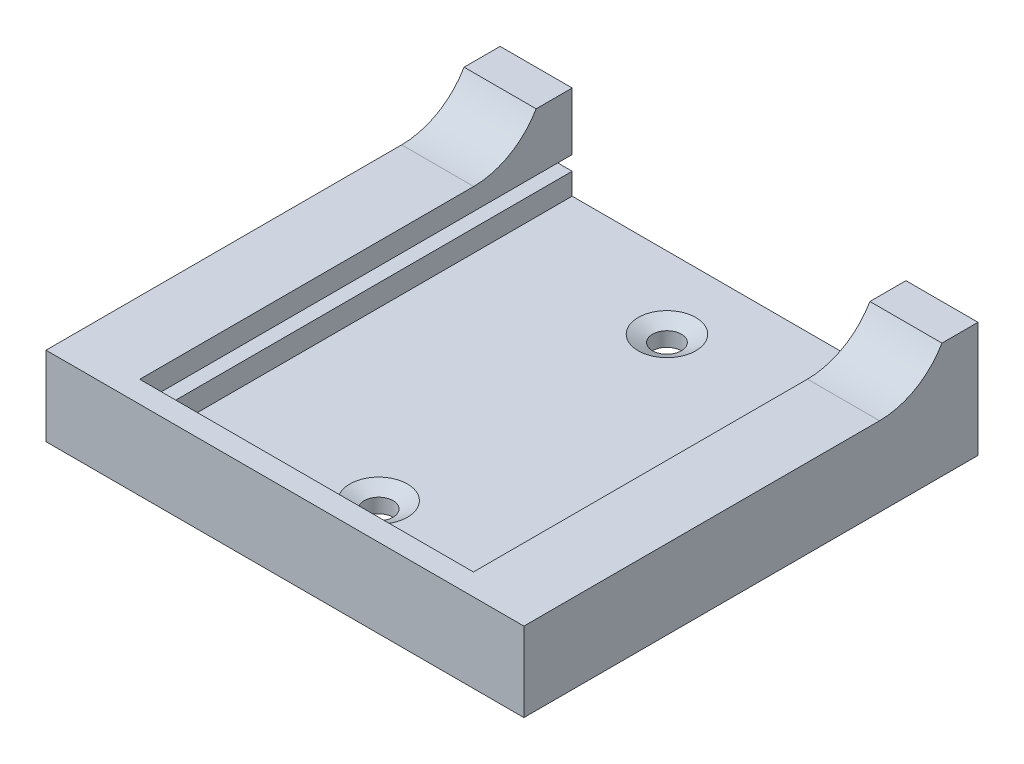
ISO-10303-21;
HEADER;
FILE_DESCRIPTION(('STEP AP214'),'2;1');
FILE_NAME('part.step','',(''),(''),'','','');
FILE_SCHEMA(('AUTOMOTIVE_DESIGN { 1 0 10303 214 1 1 1 1 }'));
ENDSEC;
DATA;
#1=APPLICATION_CONTEXT('core data for automotive mechanical design processes');
#2=APPLICATION_PROTOCOL_DEFINITION('international standard','automotive_design',2000,#1);
#3=PRODUCT_CONTEXT('',#1,'mechanical');
#4=PRODUCT('Part','Part','',(#3));
#5=PRODUCT_RELATED_PRODUCT_CATEGORY('part','',(#4));
#6=PRODUCT_DEFINITION_FORMATION('','',#4);
#7=PRODUCT_DEFINITION_CONTEXT('part definition',#1,'design');
#8=PRODUCT_DEFINITION('design','',#6,#7);
#9=PRODUCT_DEFINITION_SHAPE('','',#8);
#10=(LENGTH_UNIT() NAMED_UNIT(*) SI_UNIT(.MILLI.,.METRE.));
#11=(NAMED_UNIT(*) PLANE_ANGLE_UNIT() SI_UNIT($,.RADIAN.));
#12=(NAMED_UNIT(*) SI_UNIT($,.STERADIAN.) SOLID_ANGLE_UNIT());
#13=UNCERTAINTY_MEASURE_WITH_UNIT(LENGTH_MEASURE(1.E-05),#10,'distance_accuracy_value','');
#14=(GEOMETRIC_REPRESENTATION_CONTEXT(3) GLOBAL_UNCERTAINTY_ASSIGNED_CONTEXT((#13)) GLOBAL_UNIT_ASSIGNED_CONTEXT((#10,
#11,#12)) REPRESENTATION_CONTEXT('',''));
#15=CARTESIAN_POINT('',(0.,0.,0.));
#16=DIRECTION('',(0.,0.,1.));
#17=DIRECTION('',(1.,0.,0.));
#18=AXIS2_PLACEMENT_3D('',#15,#16,#17);
#19=CARTESIAN_POINT('',(0.,11.,72.8062484748657));
#20=DIRECTION('',(0.,-1.,0.));
#21=DIRECTION('',(0.,0.,-1.));
#22=AXIS2_PLACEMENT_3D('',#19,#20,#21);
#23=PLANE('',#22);
#24=DIRECTION('',(0.,0.,-1.));
#25=VECTOR('',#24,1.);
#26=CARTESIAN_POINT('',(66.3,11.,72.8062484748657));
#27=LINE('',#26,#25);
#28=CARTESIAN_POINT('',(66.3,11.,63.));
#29=VERTEX_POINT('',#28);
#30=CARTESIAN_POINT('',(66.3,11.,13.6602540378444));
#31=VERTEX_POINT('',#30);
#32=EDGE_CURVE('E484',#29,#31,#27,.T.);
#33=ORIENTED_EDGE('',*,*,#32,.T.);
#34=DIRECTION('',(1.,0.,0.));
#35=VECTOR('',#34,1.);
#36=CARTESIAN_POINT('',(0.,11.,13.6602540378444));
#37=LINE('',#36,#35);
#38=CARTESIAN_POINT('',(56.3,11.,13.6602540378444));
#39=VERTEX_POINT('',#38);
#40=EDGE_CURVE('E443',#31,#39,#37,.F.);
#41=ORIENTED_EDGE('',*,*,#40,.T.);
#42=DIRECTION('',(0.,0.,-1.));
#43=VECTOR('',#42,1.);
#44=CARTESIAN_POINT('',(56.3,11.,72.8062484748657));
#45=LINE('',#44,#43);
#46=CARTESIAN_POINT('',(56.3,11.,60.));
#47=VERTEX_POINT('',#46);
#48=EDGE_CURVE('E238',#47,#39,#45,.T.);
#49=ORIENTED_EDGE('',*,*,#48,.F.);
#50=DIRECTION('',(-1.,0.,0.));
#51=VECTOR('',#50,1.);
#52=CARTESIAN_POINT('',(0.,11.,60.));
#53=LINE('',#52,#51);
#54=CARTESIAN_POINT('',(10.,11.,60.));
#55=VERTEX_POINT('',#54);
#56=EDGE_CURVE('E212',#47,#55,#53,.T.);
#57=ORIENTED_EDGE('',*,*,#56,.T.);
#58=DIRECTION('',(0.,0.,-1.));
#59=VECTOR('',#58,1.);
#60=CARTESIAN_POINT('',(10.,11.,72.8062484748657));
#61=LINE('',#60,#59);
#62=CARTESIAN_POINT('',(10.,11.,13.6602540378444));
#63=VERTEX_POINT('',#62);
#64=EDGE_CURVE('E260',#55,#63,#61,.T.);
#65=ORIENTED_EDGE('',*,*,#64,.T.);
#66=DIRECTION('',(1.,0.,0.));
#67=VECTOR('',#66,1.);
#68=CARTESIAN_POINT('',(0.,11.,13.6602540378444));
#69=LINE('',#68,#67);
#70=CARTESIAN_POINT('',(0.,11.,13.6602540378444));
#71=VERTEX_POINT('',#70);
#72=EDGE_CURVE('E54',#63,#71,#69,.F.);
#73=ORIENTED_EDGE('',*,*,#72,.T.);
#74=DIRECTION('',(0.,0.,-1.));
#75=VECTOR('',#74,1.);
#76=CARTESIAN_POINT('',(0.,11.,72.8062484748657));
#77=LINE('',#76,#75);
#78=CARTESIAN_POINT('',(0.,11.,63.));
#79=VERTEX_POINT('',#78);
#80=EDGE_CURVE('E257',#79,#71,#77,.T.);
#81=ORIENTED_EDGE('',*,*,#80,.F.);
#82=DIRECTION('',(-1.,0.,0.));
#83=VECTOR('',#82,1.);
#84=CARTESIAN_POINT('',(0.,11.,63.));
#85=LINE('',#84,#83);
#86=EDGE_CURVE('E222',#29,#79,#85,.T.);
#87=ORIENTED_EDGE('',*,*,#86,.F.);
#88=EDGE_LOOP('',(#33,#41,#49,#57,#65,#73,#81,#87));
#89=FACE_BOUND('',#88,.T.);
#90=ADVANCED_FACE('F31',(#89),#23,.F.);
#91=CARTESIAN_POINT('',(0.,3.,60.));
#92=DIRECTION('',(0.,-1.,0.));
#93=DIRECTION('',(0.,0.,-1.));
#94=AXIS2_PLACEMENT_3D('',#91,#92,#93);
#95=PLANE('',#94);
#96=CARTESIAN_POINT('',(33.15,3.,10.));
#97=DIRECTION('',(0.,-1.,0.));
#98=DIRECTION('',(0.,0.,-1.));
#99=AXIS2_PLACEMENT_3D('',#96,#97,#98);
#100=CIRCLE('',#99,4.00000000000002);
#101=CARTESIAN_POINT('',(33.15,3.,5.99999999999999));
#102=VERTEX_POINT('',#101);
#103=EDGE_CURVE('E445',#102,#102,#100,.T.);
#104=ORIENTED_EDGE('',*,*,#103,.T.);
#105=EDGE_LOOP('',(#104));
#106=FACE_BOUND('',#105,.T.);
#107=CARTESIAN_POINT('',(33.15,3.,50.));
#108=DIRECTION('',(0.,-1.,0.));
#109=DIRECTION('',(0.,0.,-1.));
#110=AXIS2_PLACEMENT_3D('',#107,#108,#109);
#111=CIRCLE('',#110,4.);
#112=CARTESIAN_POINT('',(33.15,3.,46.));
#113=VERTEX_POINT('',#112);
#114=EDGE_CURVE('E449',#113,#113,#111,.T.);
#115=ORIENTED_EDGE('',*,*,#114,.T.);
#116=EDGE_LOOP('',(#115));
#117=FACE_BOUND('',#116,.T.);
#118=DIRECTION('',(0.,0.,-1.));
#119=VECTOR('',#118,1.);
#120=CARTESIAN_POINT('',(56.3,3.,72.8062484748657));
#121=LINE('',#120,#119);
#122=CARTESIAN_POINT('',(56.3,3.,60.));
#123=VERTEX_POINT('',#122);
#124=CARTESIAN_POINT('',(56.3,3.,0.));
#125=VERTEX_POINT('',#124);
#126=EDGE_CURVE('E485',#123,#125,#121,.T.);
#127=ORIENTED_EDGE('',*,*,#126,.T.);
#128=DIRECTION('',(-1.,0.,0.));
#129=VECTOR('',#128,1.);
#130=CARTESIAN_POINT('',(0.,3.,0.));
#131=LINE('',#130,#129);
#132=CARTESIAN_POINT('',(10.,3.,0.));
#133=VERTEX_POINT('',#132);
#134=EDGE_CURVE('E299',#125,#133,#131,.T.);
#135=ORIENTED_EDGE('',*,*,#134,.T.);
#136=DIRECTION('',(0.,0.,-1.));
#137=VECTOR('',#136,1.);
#138=CARTESIAN_POINT('',(10.,3.,72.8062484748657));
#139=LINE('',#138,#137);
#140=CARTESIAN_POINT('',(10.,3.,60.));
#141=VERTEX_POINT('',#140);
#142=EDGE_CURVE('E275',#141,#133,#139,.T.);
#143=ORIENTED_EDGE('',*,*,#142,.F.);
#144=DIRECTION('',(-1.,0.,0.));
#145=VECTOR('',#144,1.);
#146=CARTESIAN_POINT('',(0.,3.,60.));
#147=LINE('',#146,#145);
#148=EDGE_CURVE('E302',#123,#141,#147,.T.);
#149=ORIENTED_EDGE('',*,*,#148,.F.);
#150=EDGE_LOOP('',(#127,#135,#143,#149));
#151=FACE_BOUND('',#150,.T.);
#152=ADVANCED_FACE('F321',(#106,#117,#151),#95,.F.);
#153=CARTESIAN_POINT('',(0.,0.,60.));
#154=DIRECTION('',(1.,0.,0.));
#155=DIRECTION('',(0.,0.,-1.));
#156=AXIS2_PLACEMENT_3D('',#153,#154,#155);
#157=PLANE('',#156);
#158=DIRECTION('',(0.,-1.,0.));
#159=VECTOR('',#158,1.);
#160=CARTESIAN_POINT('',(0.,0.,0.));
#161=LINE('',#160,#159);
#162=CARTESIAN_POINT('',(0.,16.,0.));
#163=VERTEX_POINT('',#162);
#164=CARTESIAN_POINT('',(0.,0.,0.));
#165=VERTEX_POINT('',#164);
#166=EDGE_CURVE('E295',#163,#165,#161,.T.);
#167=ORIENTED_EDGE('',*,*,#166,.T.);
#168=DIRECTION('',(0.,0.,-1.));
#169=VECTOR('',#168,1.);
#170=CARTESIAN_POINT('',(0.,0.,60.));
#171=LINE('',#170,#169);
#172=CARTESIAN_POINT('',(0.,0.,63.));
#173=VERTEX_POINT('',#172);
#174=EDGE_CURVE('E285',#173,#165,#171,.T.);
#175=ORIENTED_EDGE('',*,*,#174,.F.);
#176=DIRECTION('',(0.,-1.,0.));
#177=VECTOR('',#176,1.);
#178=CARTESIAN_POINT('',(0.,11.,63.));
#179=LINE('',#178,#177);
#180=EDGE_CURVE('E213',#79,#173,#179,.T.);
#181=ORIENTED_EDGE('',*,*,#180,.F.);
#182=ORIENTED_EDGE('',*,*,#80,.T.);
#183=CARTESIAN_POINT('',(0.,21.,13.6602540378444));
#184=DIRECTION('',(1.,0.,0.));
#185=DIRECTION('',(0.,0.,-1.));
#186=AXIS2_PLACEMENT_3D('',#183,#184,#185);
#187=CIRCLE('',#186,10.);
#188=CARTESIAN_POINT('',(0.,16.,5.));
#189=VERTEX_POINT('',#188);
#190=EDGE_CURVE('E11',#71,#189,#187,.T.);
#191=ORIENTED_EDGE('',*,*,#190,.T.);
#192=DIRECTION('',(0.,0.,1.));
#193=VECTOR('',#192,1.);
#194=CARTESIAN_POINT('',(0.,16.,0.));
#195=LINE('',#194,#193);
#196=EDGE_CURVE('E200',#163,#189,#195,.T.);
#197=ORIENTED_EDGE('',*,*,#196,.F.);
#198=EDGE_LOOP('',(#167,#175,#181,#182,#191,#197));
#199=FACE_BOUND('',#198,.T.);
#200=ADVANCED_FACE('F370',(#199),#157,.F.);
#201=CARTESIAN_POINT('',(0.,0.,60.));
#202=DIRECTION('',(0.,1.,0.));
#203=DIRECTION('',(0.,0.,1.));
#204=AXIS2_PLACEMENT_3D('',#201,#202,#203);
#205=PLANE('',#204);
#206=CARTESIAN_POINT('',(33.15,0.,50.));
#207=DIRECTION('',(0.,1.,0.));
#208=DIRECTION('',(0.,0.,1.));
#209=AXIS2_PLACEMENT_3D('',#206,#207,#208);
#210=CIRCLE('',#209,2.);
#211=CARTESIAN_POINT('',(33.15,0.,52.));
#212=VERTEX_POINT('',#211);
#213=EDGE_CURVE('E225',#212,#212,#210,.T.);
#214=ORIENTED_EDGE('',*,*,#213,.T.);
#215=EDGE_LOOP('',(#214));
#216=FACE_BOUND('',#215,.T.);
#217=CARTESIAN_POINT('',(33.15,0.,10.));
#218=DIRECTION('',(0.,1.,0.));
#219=DIRECTION('',(0.,0.,1.));
#220=AXIS2_PLACEMENT_3D('',#217,#218,#219);
#221=CIRCLE('',#220,2.);
#222=CARTESIAN_POINT('',(33.15,0.,12.));
#223=VERTEX_POINT('',#222);
#224=EDGE_CURVE('E180',#223,#223,#221,.T.);
#225=ORIENTED_EDGE('',*,*,#224,.T.);
#226=EDGE_LOOP('',(#225));
#227=FACE_BOUND('',#226,.T.);
#228=DIRECTION('',(1.,0.,0.));
#229=VECTOR('',#228,1.);
#230=CARTESIAN_POINT('',(0.,0.,0.));
#231=LINE('',#230,#229);
#232=CARTESIAN_POINT('',(66.3,0.,0.));
#233=VERTEX_POINT('',#232);
#234=EDGE_CURVE('E358',#165,#233,#231,.T.);
#235=ORIENTED_EDGE('',*,*,#234,.T.);
#236=DIRECTION('',(0.,0.,-1.));
#237=VECTOR('',#236,1.);
#238=CARTESIAN_POINT('',(66.3,0.,60.));
#239=LINE('',#238,#237);
#240=CARTESIAN_POINT('',(66.3,0.,63.));
#241=VERTEX_POINT('',#240);
#242=EDGE_CURVE('E308',#241,#233,#239,.T.);
#243=ORIENTED_EDGE('',*,*,#242,.F.);
#244=DIRECTION('',(1.,0.,0.));
#245=VECTOR('',#244,1.);
#246=CARTESIAN_POINT('',(0.,0.,63.));
#247=LINE('',#246,#245);
#248=EDGE_CURVE('E216',#173,#241,#247,.T.);
#249=ORIENTED_EDGE('',*,*,#248,.F.);
#250=ORIENTED_EDGE('',*,*,#174,.T.);
#251=EDGE_LOOP('',(#235,#243,#249,#250));
#252=FACE_BOUND('',#251,.T.);
#253=ADVANCED_FACE('F363',(#216,#227,#252),#205,.F.);
#254=CARTESIAN_POINT('',(66.3,0.,60.));
#255=DIRECTION('',(-1.,0.,0.));
#256=DIRECTION('',(0.,0.,1.));
#257=AXIS2_PLACEMENT_3D('',#254,#255,#256);
#258=PLANE('',#257);
#259=DIRECTION('',(0.,1.,0.));
#260=VECTOR('',#259,1.);
#261=CARTESIAN_POINT('',(66.3,0.,0.));
#262=LINE('',#261,#260);
#263=CARTESIAN_POINT('',(66.3,16.,0.));
#264=VERTEX_POINT('',#263);
#265=EDGE_CURVE('E303',#233,#264,#262,.T.);
#266=ORIENTED_EDGE('',*,*,#265,.T.);
#267=DIRECTION('',(0.,0.,-1.));
#268=VECTOR('',#267,1.);
#269=CARTESIAN_POINT('',(66.3,16.,0.));
#270=LINE('',#269,#268);
#271=CARTESIAN_POINT('',(66.3,16.,5.));
#272=VERTEX_POINT('',#271);
#273=EDGE_CURVE('E195',#272,#264,#270,.T.);
#274=ORIENTED_EDGE('',*,*,#273,.F.);
#275=CARTESIAN_POINT('',(66.3,21.,13.6602540378444));
#276=DIRECTION('',(-1.,0.,0.));
#277=DIRECTION('',(0.,0.,1.));
#278=AXIS2_PLACEMENT_3D('',#275,#276,#277);
#279=CIRCLE('',#278,10.);
#280=EDGE_CURVE('E46',#272,#31,#279,.T.);
#281=ORIENTED_EDGE('',*,*,#280,.T.);
#282=ORIENTED_EDGE('',*,*,#32,.F.);
#283=DIRECTION('',(0.,1.,0.));
#284=VECTOR('',#283,1.);
#285=CARTESIAN_POINT('',(66.3,11.,63.));
#286=LINE('',#285,#284);
#287=EDGE_CURVE('E219',#241,#29,#286,.T.);
#288=ORIENTED_EDGE('',*,*,#287,.F.);
#289=ORIENTED_EDGE('',*,*,#242,.T.);
#290=EDGE_LOOP('',(#266,#274,#281,#282,#288,#289));
#291=FACE_BOUND('',#290,.T.);
#292=ADVANCED_FACE('F361',(#291),#258,.F.);
#293=CARTESIAN_POINT('',(0.,3.,0.));
#294=DIRECTION('',(0.,0.,-1.));
#295=DIRECTION('',(-1.,0.,0.));
#296=AXIS2_PLACEMENT_3D('',#293,#294,#295);
#297=PLANE('',#296);
#298=ORIENTED_EDGE('',*,*,#166,.F.);
#299=DIRECTION('',(-1.,0.,0.));
#300=VECTOR('',#299,1.);
#301=CARTESIAN_POINT('',(0.,16.,0.));
#302=LINE('',#301,#300);
#303=CARTESIAN_POINT('',(10.,16.,0.));
#304=VERTEX_POINT('',#303);
#305=EDGE_CURVE('E209',#304,#163,#302,.T.);
#306=ORIENTED_EDGE('',*,*,#305,.F.);
#307=DIRECTION('',(0.,1.,0.));
#308=VECTOR('',#307,1.);
#309=CARTESIAN_POINT('',(10.,11.,0.));
#310=LINE('',#309,#308);
#311=CARTESIAN_POINT('',(10.,8.,0.));
#312=VERTEX_POINT('',#311);
#313=EDGE_CURVE('E261',#312,#304,#310,.T.);
#314=ORIENTED_EDGE('',*,*,#313,.F.);
#315=DIRECTION('',(1.,0.,0.));
#316=VECTOR('',#315,1.);
#317=CARTESIAN_POINT('',(3.,8.,0.));
#318=LINE('',#317,#316);
#319=CARTESIAN_POINT('',(3.,8.,0.));
#320=VERTEX_POINT('',#319);
#321=EDGE_CURVE('E341',#320,#312,#318,.T.);
#322=ORIENTED_EDGE('',*,*,#321,.F.);
#323=DIRECTION('',(0.,1.,0.));
#324=VECTOR('',#323,1.);
#325=CARTESIAN_POINT('',(3.,6.,0.));
#326=LINE('',#325,#324);
#327=CARTESIAN_POINT('',(3.,6.,0.));
#328=VERTEX_POINT('',#327);
#329=EDGE_CURVE('E339',#328,#320,#326,.T.);
#330=ORIENTED_EDGE('',*,*,#329,.F.);
#331=DIRECTION('',(-1.,0.,0.));
#332=VECTOR('',#331,1.);
#333=CARTESIAN_POINT('',(3.,6.,0.));
#334=LINE('',#333,#332);
#335=CARTESIAN_POINT('',(10.,6.,0.));
#336=VERTEX_POINT('',#335);
#337=EDGE_CURVE('E289',#336,#328,#334,.T.);
#338=ORIENTED_EDGE('',*,*,#337,.F.);
#339=DIRECTION('',(0.,1.,0.));
#340=VECTOR('',#339,1.);
#341=CARTESIAN_POINT('',(10.,6.,0.));
#342=LINE('',#341,#340);
#343=EDGE_CURVE('E254',#133,#336,#342,.T.);
#344=ORIENTED_EDGE('',*,*,#343,.F.);
#345=ORIENTED_EDGE('',*,*,#134,.F.);
#346=DIRECTION('',(0.,-1.,0.));
#347=VECTOR('',#346,1.);
#348=CARTESIAN_POINT('',(56.3,6.,0.));
#349=LINE('',#348,#347);
#350=CARTESIAN_POINT('',(56.3,6.,0.));
#351=VERTEX_POINT('',#350);
#352=EDGE_CURVE('E486',#351,#125,#349,.T.);
#353=ORIENTED_EDGE('',*,*,#352,.F.);
#354=DIRECTION('',(-1.,0.,0.));
#355=VECTOR('',#354,1.);
#356=CARTESIAN_POINT('',(63.3,6.,0.));
#357=LINE('',#356,#355);
#358=CARTESIAN_POINT('',(63.3,6.,0.));
#359=VERTEX_POINT('',#358);
#360=EDGE_CURVE('E491',#359,#351,#357,.T.);
#361=ORIENTED_EDGE('',*,*,#360,.F.);
#362=DIRECTION('',(0.,-1.,0.));
#363=VECTOR('',#362,1.);
#364=CARTESIAN_POINT('',(63.3,6.,0.));
#365=LINE('',#364,#363);
#366=CARTESIAN_POINT('',(63.3,8.,0.));
#367=VERTEX_POINT('',#366);
#368=EDGE_CURVE('E498',#367,#359,#365,.T.);
#369=ORIENTED_EDGE('',*,*,#368,.F.);
#370=DIRECTION('',(1.,0.,0.));
#371=VECTOR('',#370,1.);
#372=CARTESIAN_POINT('',(63.3,8.,0.));
#373=LINE('',#372,#371);
#374=CARTESIAN_POINT('',(56.3,8.,0.));
#375=VERTEX_POINT('',#374);
#376=EDGE_CURVE('E177',#375,#367,#373,.T.);
#377=ORIENTED_EDGE('',*,*,#376,.F.);
#378=DIRECTION('',(0.,-1.,0.));
#379=VECTOR('',#378,1.);
#380=CARTESIAN_POINT('',(56.3,11.,0.));
#381=LINE('',#380,#379);
#382=CARTESIAN_POINT('',(56.3,16.,0.));
#383=VERTEX_POINT('',#382);
#384=EDGE_CURVE('E169',#383,#375,#381,.T.);
#385=ORIENTED_EDGE('',*,*,#384,.F.);
#386=DIRECTION('',(-1.,0.,0.));
#387=VECTOR('',#386,1.);
#388=CARTESIAN_POINT('',(66.3,16.,0.));
#389=LINE('',#388,#387);
#390=EDGE_CURVE('E174',#264,#383,#389,.T.);
#391=ORIENTED_EDGE('',*,*,#390,.F.);
#392=ORIENTED_EDGE('',*,*,#265,.F.);
#393=ORIENTED_EDGE('',*,*,#234,.F.);
#394=EDGE_LOOP('',(#298,#306,#314,#322,#330,#338,#344,#345,#353,#361,#369,#377,#385,#391,#392,#393));
#395=FACE_BOUND('',#394,.T.);
#396=ADVANCED_FACE('F171',(#395),#297,.T.);
#397=CARTESIAN_POINT('',(10.,11.,72.8062484748657));
#398=DIRECTION('',(-1.,0.,0.));
#399=DIRECTION('',(0.,0.,1.));
#400=AXIS2_PLACEMENT_3D('',#397,#398,#399);
#401=PLANE('',#400);
#402=ORIENTED_EDGE('',*,*,#64,.F.);
#403=DIRECTION('',(0.,-1.,0.));
#404=VECTOR('',#403,1.);
#405=CARTESIAN_POINT('',(10.,11.,60.));
#406=LINE('',#405,#404);
#407=CARTESIAN_POINT('',(10.,8.,60.));
#408=VERTEX_POINT('',#407);
#409=EDGE_CURVE('E284',#55,#408,#406,.T.);
#410=ORIENTED_EDGE('',*,*,#409,.T.);
#411=DIRECTION('',(0.,0.,-1.));
#412=VECTOR('',#411,1.);
#413=CARTESIAN_POINT('',(10.,8.,72.8062484748657));
#414=LINE('',#413,#412);
#415=EDGE_CURVE('E267',#408,#312,#414,.T.);
#416=ORIENTED_EDGE('',*,*,#415,.T.);
#417=ORIENTED_EDGE('',*,*,#313,.T.);
#418=DIRECTION('',(0.,0.,-1.));
#419=VECTOR('',#418,1.);
#420=CARTESIAN_POINT('',(10.,16.,0.));
#421=LINE('',#420,#419);
#422=CARTESIAN_POINT('',(10.,16.,5.));
#423=VERTEX_POINT('',#422);
#424=EDGE_CURVE('E206',#423,#304,#421,.T.);
#425=ORIENTED_EDGE('',*,*,#424,.F.);
#426=CARTESIAN_POINT('',(10.,21.,13.6602540378444));
#427=DIRECTION('',(-1.,0.,0.));
#428=DIRECTION('',(0.,0.,1.));
#429=AXIS2_PLACEMENT_3D('',#426,#427,#428);
#430=CIRCLE('',#429,10.);
#431=EDGE_CURVE('E39',#423,#63,#430,.T.);
#432=ORIENTED_EDGE('',*,*,#431,.T.);
#433=EDGE_LOOP('',(#402,#410,#416,#417,#425,#432));
#434=FACE_BOUND('',#433,.T.);
#435=ADVANCED_FACE('F350',(#434),#401,.F.);
#436=CARTESIAN_POINT('',(3.,8.,72.8062484748657));
#437=DIRECTION('',(0.,1.,0.));
#438=DIRECTION('',(0.,0.,1.));
#439=AXIS2_PLACEMENT_3D('',#436,#437,#438);
#440=PLANE('',#439);
#441=ORIENTED_EDGE('',*,*,#415,.F.);
#442=DIRECTION('',(-1.,0.,0.));
#443=VECTOR('',#442,1.);
#444=CARTESIAN_POINT('',(3.,8.,60.));
#445=LINE('',#444,#443);
#446=CARTESIAN_POINT('',(3.,8.,60.));
#447=VERTEX_POINT('',#446);
#448=EDGE_CURVE('E334',#408,#447,#445,.T.);
#449=ORIENTED_EDGE('',*,*,#448,.T.);
#450=DIRECTION('',(0.,0.,-1.));
#451=VECTOR('',#450,1.);
#452=CARTESIAN_POINT('',(3.,8.,72.8062484748657));
#453=LINE('',#452,#451);
#454=EDGE_CURVE('E269',#447,#320,#453,.T.);
#455=ORIENTED_EDGE('',*,*,#454,.T.);
#456=ORIENTED_EDGE('',*,*,#321,.T.);
#457=EDGE_LOOP('',(#441,#449,#455,#456));
#458=FACE_BOUND('',#457,.T.);
#459=ADVANCED_FACE('F385',(#458),#440,.F.);
#460=CARTESIAN_POINT('',(3.,6.,72.8062484748657));
#461=DIRECTION('',(-1.,0.,0.));
#462=DIRECTION('',(0.,0.,1.));
#463=AXIS2_PLACEMENT_3D('',#460,#461,#462);
#464=PLANE('',#463);
#465=ORIENTED_EDGE('',*,*,#454,.F.);
#466=DIRECTION('',(0.,-1.,0.));
#467=VECTOR('',#466,1.);
#468=CARTESIAN_POINT('',(3.,6.,60.));
#469=LINE('',#468,#467);
#470=CARTESIAN_POINT('',(3.,6.,60.));
#471=VERTEX_POINT('',#470);
#472=EDGE_CURVE('E332',#447,#471,#469,.T.);
#473=ORIENTED_EDGE('',*,*,#472,.T.);
#474=DIRECTION('',(0.,0.,-1.));
#475=VECTOR('',#474,1.);
#476=CARTESIAN_POINT('',(3.,6.,72.8062484748657));
#477=LINE('',#476,#475);
#478=EDGE_CURVE('E271',#471,#328,#477,.T.);
#479=ORIENTED_EDGE('',*,*,#478,.T.);
#480=ORIENTED_EDGE('',*,*,#329,.T.);
#481=EDGE_LOOP('',(#465,#473,#479,#480));
#482=FACE_BOUND('',#481,.T.);
#483=ADVANCED_FACE('F388',(#482),#464,.F.);
#484=CARTESIAN_POINT('',(3.,6.,72.8062484748657));
#485=DIRECTION('',(0.,-1.,0.));
#486=DIRECTION('',(0.,0.,-1.));
#487=AXIS2_PLACEMENT_3D('',#484,#485,#486);
#488=PLANE('',#487);
#489=ORIENTED_EDGE('',*,*,#478,.F.);
#490=DIRECTION('',(1.,0.,0.));
#491=VECTOR('',#490,1.);
#492=CARTESIAN_POINT('',(3.,6.,60.));
#493=LINE('',#492,#491);
#494=CARTESIAN_POINT('',(10.,6.,60.));
#495=VERTEX_POINT('',#494);
#496=EDGE_CURVE('E296',#471,#495,#493,.T.);
#497=ORIENTED_EDGE('',*,*,#496,.T.);
#498=DIRECTION('',(0.,0.,-1.));
#499=VECTOR('',#498,1.);
#500=CARTESIAN_POINT('',(10.,6.,72.8062484748657));
#501=LINE('',#500,#499);
#502=EDGE_CURVE('E273',#495,#336,#501,.T.);
#503=ORIENTED_EDGE('',*,*,#502,.T.);
#504=ORIENTED_EDGE('',*,*,#337,.T.);
#505=EDGE_LOOP('',(#489,#497,#503,#504));
#506=FACE_BOUND('',#505,.T.);
#507=ADVANCED_FACE('F330',(#506),#488,.F.);
#508=CARTESIAN_POINT('',(10.,6.,72.8062484748657));
#509=DIRECTION('',(-1.,0.,0.));
#510=DIRECTION('',(0.,-1.,0.));
#511=AXIS2_PLACEMENT_3D('',#508,#509,#510);
#512=PLANE('',#511);
#513=ORIENTED_EDGE('',*,*,#502,.F.);
#514=DIRECTION('',(0.,-1.,0.));
#515=VECTOR('',#514,1.);
#516=CARTESIAN_POINT('',(10.,6.,60.));
#517=LINE('',#516,#515);
#518=EDGE_CURVE('E292',#495,#141,#517,.T.);
#519=ORIENTED_EDGE('',*,*,#518,.T.);
#520=ORIENTED_EDGE('',*,*,#142,.T.);
#521=ORIENTED_EDGE('',*,*,#343,.T.);
#522=EDGE_LOOP('',(#513,#519,#520,#521));
#523=FACE_BOUND('',#522,.T.);
#524=ADVANCED_FACE('F324',(#523),#512,.F.);
#525=CARTESIAN_POINT('',(56.3,6.,72.8062484748657));
#526=DIRECTION('',(1.,0.,0.));
#527=DIRECTION('',(0.,1.,0.));
#528=AXIS2_PLACEMENT_3D('',#525,#526,#527);
#529=PLANE('',#528);
#530=ORIENTED_EDGE('',*,*,#126,.F.);
#531=DIRECTION('',(0.,1.,0.));
#532=VECTOR('',#531,1.);
#533=CARTESIAN_POINT('',(56.3,6.,60.));
#534=LINE('',#533,#532);
#535=CARTESIAN_POINT('',(56.3,6.,60.));
#536=VERTEX_POINT('',#535);
#537=EDGE_CURVE('E234',#123,#536,#534,.T.);
#538=ORIENTED_EDGE('',*,*,#537,.T.);
#539=DIRECTION('',(0.,0.,-1.));
#540=VECTOR('',#539,1.);
#541=CARTESIAN_POINT('',(56.3,6.,72.8062484748657));
#542=LINE('',#541,#540);
#543=EDGE_CURVE('E488',#536,#351,#542,.T.);
#544=ORIENTED_EDGE('',*,*,#543,.T.);
#545=ORIENTED_EDGE('',*,*,#352,.T.);
#546=EDGE_LOOP('',(#530,#538,#544,#545));
#547=FACE_BOUND('',#546,.T.);
#548=ADVANCED_FACE('F395',(#547),#529,.F.);
#549=CARTESIAN_POINT('',(63.3,6.,72.8062484748657));
#550=DIRECTION('',(0.,-1.,0.));
#551=DIRECTION('',(0.,0.,-1.));
#552=AXIS2_PLACEMENT_3D('',#549,#550,#551);
#553=PLANE('',#552);
#554=ORIENTED_EDGE('',*,*,#543,.F.);
#555=DIRECTION('',(1.,0.,0.));
#556=VECTOR('',#555,1.);
#557=CARTESIAN_POINT('',(63.3,6.,60.));
#558=LINE('',#557,#556);
#559=CARTESIAN_POINT('',(63.3,6.,60.));
#560=VERTEX_POINT('',#559);
#561=EDGE_CURVE('E237',#536,#560,#558,.T.);
#562=ORIENTED_EDGE('',*,*,#561,.T.);
#563=DIRECTION('',(0.,0.,-1.));
#564=VECTOR('',#563,1.);
#565=CARTESIAN_POINT('',(63.3,6.,72.8062484748657));
#566=LINE('',#565,#564);
#567=EDGE_CURVE('E424',#560,#359,#566,.T.);
#568=ORIENTED_EDGE('',*,*,#567,.T.);
#569=ORIENTED_EDGE('',*,*,#360,.T.);
#570=EDGE_LOOP('',(#554,#562,#568,#569));
#571=FACE_BOUND('',#570,.T.);
#572=ADVANCED_FACE('F399',(#571),#553,.F.);
#573=CARTESIAN_POINT('',(63.3,6.,72.8062484748657));
#574=DIRECTION('',(1.,0.,0.));
#575=DIRECTION('',(0.,0.,-1.));
#576=AXIS2_PLACEMENT_3D('',#573,#574,#575);
#577=PLANE('',#576);
#578=ORIENTED_EDGE('',*,*,#567,.F.);
#579=DIRECTION('',(0.,1.,0.));
#580=VECTOR('',#579,1.);
#581=CARTESIAN_POINT('',(63.3,6.,60.));
#582=LINE('',#581,#580);
#583=CARTESIAN_POINT('',(63.3,8.,60.));
#584=VERTEX_POINT('',#583);
#585=EDGE_CURVE('E241',#560,#584,#582,.T.);
#586=ORIENTED_EDGE('',*,*,#585,.T.);
#587=DIRECTION('',(0.,0.,-1.));
#588=VECTOR('',#587,1.);
#589=CARTESIAN_POINT('',(63.3,8.,72.8062484748657));
#590=LINE('',#589,#588);
#591=EDGE_CURVE('E421',#584,#367,#590,.T.);
#592=ORIENTED_EDGE('',*,*,#591,.T.);
#593=ORIENTED_EDGE('',*,*,#368,.T.);
#594=EDGE_LOOP('',(#578,#586,#592,#593));
#595=FACE_BOUND('',#594,.T.);
#596=ADVANCED_FACE('F405',(#595),#577,.F.);
#597=CARTESIAN_POINT('',(63.3,8.,72.8062484748657));
#598=DIRECTION('',(0.,1.,0.));
#599=DIRECTION('',(0.,0.,1.));
#600=AXIS2_PLACEMENT_3D('',#597,#598,#599);
#601=PLANE('',#600);
#602=ORIENTED_EDGE('',*,*,#591,.F.);
#603=DIRECTION('',(-1.,0.,0.));
#604=VECTOR('',#603,1.);
#605=CARTESIAN_POINT('',(63.3,8.,60.));
#606=LINE('',#605,#604);
#607=CARTESIAN_POINT('',(56.3,8.,60.));
#608=VERTEX_POINT('',#607);
#609=EDGE_CURVE('E244',#584,#608,#606,.T.);
#610=ORIENTED_EDGE('',*,*,#609,.T.);
#611=DIRECTION('',(0.,0.,-1.));
#612=VECTOR('',#611,1.);
#613=CARTESIAN_POINT('',(56.3,8.,72.8062484748657));
#614=LINE('',#613,#612);
#615=EDGE_CURVE('E423',#608,#375,#614,.T.);
#616=ORIENTED_EDGE('',*,*,#615,.T.);
#617=ORIENTED_EDGE('',*,*,#376,.T.);
#618=EDGE_LOOP('',(#602,#610,#616,#617));
#619=FACE_BOUND('',#618,.T.);
#620=ADVANCED_FACE('F413',(#619),#601,.F.);
#621=CARTESIAN_POINT('',(56.3,11.,72.8062484748657));
#622=DIRECTION('',(1.,0.,0.));
#623=DIRECTION('',(0.,0.,-1.));
#624=AXIS2_PLACEMENT_3D('',#621,#622,#623);
#625=PLANE('',#624);
#626=ORIENTED_EDGE('',*,*,#615,.F.);
#627=DIRECTION('',(0.,1.,0.));
#628=VECTOR('',#627,1.);
#629=CARTESIAN_POINT('',(56.3,11.,60.));
#630=LINE('',#629,#628);
#631=EDGE_CURVE('E247',#608,#47,#630,.T.);
#632=ORIENTED_EDGE('',*,*,#631,.T.);
#633=ORIENTED_EDGE('',*,*,#48,.T.);
#634=CARTESIAN_POINT('',(56.3,21.,13.6602540378444));
#635=DIRECTION('',(1.,0.,0.));
#636=DIRECTION('',(0.,0.,-1.));
#637=AXIS2_PLACEMENT_3D('',#634,#635,#636);
#638=CIRCLE('',#637,10.);
#639=CARTESIAN_POINT('',(56.3,16.,5.));
#640=VERTEX_POINT('',#639);
#641=EDGE_CURVE('E187',#39,#640,#638,.T.);
#642=ORIENTED_EDGE('',*,*,#641,.T.);
#643=DIRECTION('',(0.,0.,1.));
#644=VECTOR('',#643,1.);
#645=CARTESIAN_POINT('',(56.3,16.,0.));
#646=LINE('',#645,#644);
#647=EDGE_CURVE('E183',#383,#640,#646,.T.);
#648=ORIENTED_EDGE('',*,*,#647,.F.);
#649=ORIENTED_EDGE('',*,*,#384,.T.);
#650=EDGE_LOOP('',(#626,#632,#633,#642,#648,#649));
#651=FACE_BOUND('',#650,.T.);
#652=ADVANCED_FACE('F184',(#651),#625,.F.);
#653=CARTESIAN_POINT('',(33.15,0.,10.));
#654=DIRECTION('',(0.,1.,0.));
#655=DIRECTION('',(0.,0.,1.));
#656=AXIS2_PLACEMENT_3D('',#653,#654,#655);
#657=CYLINDRICAL_SURFACE('',#656,2.);
#658=CARTESIAN_POINT('',(33.15,1.99999999999999,10.));
#659=DIRECTION('',(0.,-1.,0.));
#660=DIRECTION('',(0.,0.,-1.));
#661=AXIS2_PLACEMENT_3D('',#658,#659,#660);
#662=CIRCLE('',#661,2.);
#663=CARTESIAN_POINT('',(33.15,1.99999999999999,8.));
#664=VERTEX_POINT('',#663);
#665=EDGE_CURVE('E312',#664,#664,#662,.F.);
#666=ORIENTED_EDGE('',*,*,#665,.T.);
#667=EDGE_LOOP('',(#666));
#668=FACE_BOUND('',#667,.T.);
#669=ORIENTED_EDGE('',*,*,#224,.F.);
#670=EDGE_LOOP('',(#669));
#671=FACE_BOUND('',#670,.T.);
#672=ADVANCED_FACE('F409',(#668,#671),#657,.F.);
#673=CARTESIAN_POINT('',(33.15,0.,50.));
#674=DIRECTION('',(0.,1.,0.));
#675=DIRECTION('',(0.,0.,1.));
#676=AXIS2_PLACEMENT_3D('',#673,#674,#675);
#677=CYLINDRICAL_SURFACE('',#676,2.);
#678=CARTESIAN_POINT('',(33.15,2.,50.));
#679=DIRECTION('',(0.,-1.,0.));
#680=DIRECTION('',(0.,0.,-1.));
#681=AXIS2_PLACEMENT_3D('',#678,#679,#680);
#682=CIRCLE('',#681,2.);
#683=CARTESIAN_POINT('',(33.15,2.,48.));
#684=VERTEX_POINT('',#683);
#685=EDGE_CURVE('E435',#684,#684,#682,.F.);
#686=ORIENTED_EDGE('',*,*,#685,.T.);
#687=EDGE_LOOP('',(#686));
#688=FACE_BOUND('',#687,.T.);
#689=ORIENTED_EDGE('',*,*,#213,.F.);
#690=EDGE_LOOP('',(#689));
#691=FACE_BOUND('',#690,.T.);
#692=ADVANCED_FACE('F461',(#688,#691),#677,.F.);
#693=CARTESIAN_POINT('',(33.15,1.99999999999999,10.));
#694=DIRECTION('',(0.,1.,0.));
#695=DIRECTION('',(0.,0.,1.));
#696=AXIS2_PLACEMENT_3D('',#693,#694,#695);
#697=CONICAL_SURFACE('',#696,2.,1.10714871779409);
#698=ORIENTED_EDGE('',*,*,#103,.F.);
#699=EDGE_LOOP('',(#698));
#700=FACE_BOUND('',#699,.T.);
#701=ORIENTED_EDGE('',*,*,#665,.F.);
#702=EDGE_LOOP('',(#701));
#703=FACE_BOUND('',#702,.T.);
#704=ADVANCED_FACE('F458',(#700,#703),#697,.F.);
#705=CARTESIAN_POINT('',(33.15,2.,50.));
#706=DIRECTION('',(0.,1.,0.));
#707=DIRECTION('',(0.,0.,1.));
#708=AXIS2_PLACEMENT_3D('',#705,#706,#707);
#709=CONICAL_SURFACE('',#708,2.,1.10714871779409);
#710=ORIENTED_EDGE('',*,*,#114,.F.);
#711=EDGE_LOOP('',(#710));
#712=FACE_BOUND('',#711,.T.);
#713=ORIENTED_EDGE('',*,*,#685,.F.);
#714=EDGE_LOOP('',(#713));
#715=FACE_BOUND('',#714,.T.);
#716=ADVANCED_FACE('F460',(#712,#715),#709,.F.);
#717=CARTESIAN_POINT('',(0.,0.,63.));
#718=DIRECTION('',(0.,0.,1.));
#719=DIRECTION('',(1.,0.,0.));
#720=AXIS2_PLACEMENT_3D('',#717,#718,#719);
#721=PLANE('',#720);
#722=ORIENTED_EDGE('',*,*,#180,.T.);
#723=ORIENTED_EDGE('',*,*,#248,.T.);
#724=ORIENTED_EDGE('',*,*,#287,.T.);
#725=ORIENTED_EDGE('',*,*,#86,.T.);
#726=EDGE_LOOP('',(#722,#723,#724,#725));
#727=FACE_BOUND('',#726,.T.);
#728=ADVANCED_FACE('F468',(#727),#721,.T.);
#729=CARTESIAN_POINT('',(0.,0.,60.));
#730=DIRECTION('',(0.,0.,1.));
#731=DIRECTION('',(1.,0.,0.));
#732=AXIS2_PLACEMENT_3D('',#729,#730,#731);
#733=PLANE('',#732);
#734=ORIENTED_EDGE('',*,*,#631,.F.);
#735=ORIENTED_EDGE('',*,*,#609,.F.);
#736=ORIENTED_EDGE('',*,*,#585,.F.);
#737=ORIENTED_EDGE('',*,*,#561,.F.);
#738=ORIENTED_EDGE('',*,*,#537,.F.);
#739=ORIENTED_EDGE('',*,*,#148,.T.);
#740=ORIENTED_EDGE('',*,*,#518,.F.);
#741=ORIENTED_EDGE('',*,*,#496,.F.);
#742=ORIENTED_EDGE('',*,*,#472,.F.);
#743=ORIENTED_EDGE('',*,*,#448,.F.);
#744=ORIENTED_EDGE('',*,*,#409,.F.);
#745=ORIENTED_EDGE('',*,*,#56,.F.);
#746=EDGE_LOOP('',(#734,#735,#736,#737,#738,#739,#740,#741,#742,#743,#744,#745));
#747=FACE_BOUND('',#746,.T.);
#748=ADVANCED_FACE('F316',(#747),#733,.F.);
#749=CARTESIAN_POINT('',(0.,16.,5.));
#750=DIRECTION('',(0.,1.,0.));
#751=DIRECTION('',(0.,0.,1.));
#752=AXIS2_PLACEMENT_3D('',#749,#750,#751);
#753=PLANE('',#752);
#754=ORIENTED_EDGE('',*,*,#196,.T.);
#755=DIRECTION('',(1.,0.,0.));
#756=VECTOR('',#755,1.);
#757=CARTESIAN_POINT('',(0.,16.,5.));
#758=LINE('',#757,#756);
#759=EDGE_CURVE('E203',#189,#423,#758,.T.);
#760=ORIENTED_EDGE('',*,*,#759,.T.);
#761=ORIENTED_EDGE('',*,*,#424,.T.);
#762=ORIENTED_EDGE('',*,*,#305,.T.);
#763=EDGE_LOOP('',(#754,#760,#761,#762));
#764=FACE_BOUND('',#763,.T.);
#765=ADVANCED_FACE('F354',(#764),#753,.T.);
#766=CARTESIAN_POINT('',(56.3,16.,0.));
#767=DIRECTION('',(0.,1.,0.));
#768=DIRECTION('',(0.,0.,1.));
#769=AXIS2_PLACEMENT_3D('',#766,#767,#768);
#770=PLANE('',#769);
#771=ORIENTED_EDGE('',*,*,#390,.T.);
#772=ORIENTED_EDGE('',*,*,#647,.T.);
#773=DIRECTION('',(1.,0.,0.));
#774=VECTOR('',#773,1.);
#775=CARTESIAN_POINT('',(66.3,16.,5.));
#776=LINE('',#775,#774);
#777=EDGE_CURVE('E191',#640,#272,#776,.T.);
#778=ORIENTED_EDGE('',*,*,#777,.T.);
#779=ORIENTED_EDGE('',*,*,#273,.T.);
#780=EDGE_LOOP('',(#771,#772,#778,#779));
#781=FACE_BOUND('',#780,.T.);
#782=ADVANCED_FACE('F194',(#781),#770,.T.);
#783=CARTESIAN_POINT('',(66.3,21.,13.6602540378444));
#784=DIRECTION('',(1.,0.,0.));
#785=DIRECTION('',(0.,0.,-1.));
#786=AXIS2_PLACEMENT_3D('',#783,#784,#785);
#787=CYLINDRICAL_SURFACE('',#786,10.);
#788=ORIENTED_EDGE('',*,*,#641,.F.);
#789=ORIENTED_EDGE('',*,*,#40,.F.);
#790=ORIENTED_EDGE('',*,*,#280,.F.);
#791=ORIENTED_EDGE('',*,*,#777,.F.);
#792=EDGE_LOOP('',(#788,#789,#790,#791));
#793=FACE_BOUND('',#792,.T.);
#794=ADVANCED_FACE('F472',(#793),#787,.F.);
#795=CARTESIAN_POINT('',(0.,21.,13.6602540378444));
#796=DIRECTION('',(1.,0.,0.));
#797=DIRECTION('',(0.,0.,-1.));
#798=AXIS2_PLACEMENT_3D('',#795,#796,#797);
#799=CYLINDRICAL_SURFACE('',#798,10.);
#800=ORIENTED_EDGE('',*,*,#190,.F.);
#801=ORIENTED_EDGE('',*,*,#72,.F.);
#802=ORIENTED_EDGE('',*,*,#431,.F.);
#803=ORIENTED_EDGE('',*,*,#759,.F.);
#804=EDGE_LOOP('',(#800,#801,#802,#803));
#805=FACE_BOUND('',#804,.T.);
#806=ADVANCED_FACE('F33',(#805),#799,.F.);
#807=CLOSED_SHELL('',(#90,#152,#200,#253,#292,#396,#435,#459,#483,#507,#524,#548,#572,#596,#620,
#652,#672,#692,#704,#716,#728,#748,#765,#782,#794,#806));
#808=MANIFOLD_SOLID_BREP('B2',#807);
#809=ADVANCED_BREP_SHAPE_REPRESENTATION('',(#18,#808),#14);
#810=SHAPE_DEFINITION_REPRESENTATION(#9,#809);
ENDSEC;
END-ISO-10303-21;
